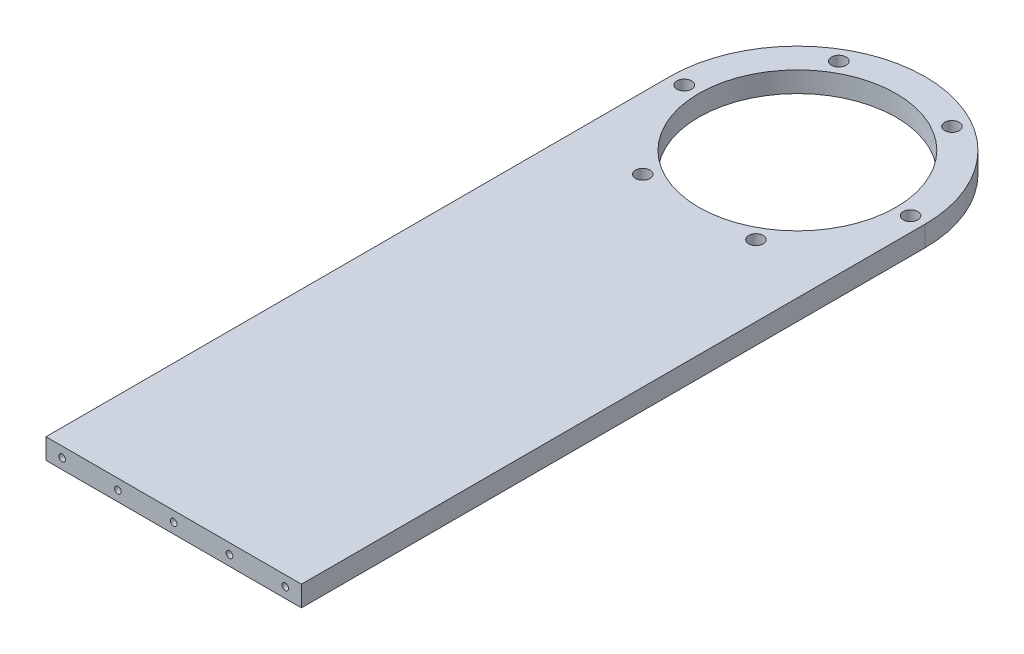
ISO-10303-21;
HEADER;
FILE_DESCRIPTION(('STEP AP214'),'2;1');
FILE_NAME('part.step','',(''),(''),'','','');
FILE_SCHEMA(('AUTOMOTIVE_DESIGN { 1 0 10303 214 1 1 1 1 }'));
ENDSEC;
DATA;
#1=APPLICATION_CONTEXT('core data for automotive mechanical design processes');
#2=APPLICATION_PROTOCOL_DEFINITION('international standard','automotive_design',2000,#1);
#3=PRODUCT_CONTEXT('',#1,'mechanical');
#4=PRODUCT('Part','Part','',(#3));
#5=PRODUCT_RELATED_PRODUCT_CATEGORY('part','',(#4));
#6=PRODUCT_DEFINITION_FORMATION('','',#4);
#7=PRODUCT_DEFINITION_CONTEXT('part definition',#1,'design');
#8=PRODUCT_DEFINITION('design','',#6,#7);
#9=PRODUCT_DEFINITION_SHAPE('','',#8);
#10=(LENGTH_UNIT() NAMED_UNIT(*) SI_UNIT(.MILLI.,.METRE.));
#11=(NAMED_UNIT(*) PLANE_ANGLE_UNIT() SI_UNIT($,.RADIAN.));
#12=(NAMED_UNIT(*) SI_UNIT($,.STERADIAN.) SOLID_ANGLE_UNIT());
#13=UNCERTAINTY_MEASURE_WITH_UNIT(LENGTH_MEASURE(1.E-05),#10,'distance_accuracy_value','');
#14=(GEOMETRIC_REPRESENTATION_CONTEXT(3) GLOBAL_UNCERTAINTY_ASSIGNED_CONTEXT((#13)) GLOBAL_UNIT_ASSIGNED_CONTEXT((#10,
#11,#12)) REPRESENTATION_CONTEXT('',''));
#15=CARTESIAN_POINT('',(0.,0.,0.));
#16=DIRECTION('',(0.,0.,1.));
#17=DIRECTION('',(1.,0.,0.));
#18=AXIS2_PLACEMENT_3D('',#15,#16,#17);
#19=CARTESIAN_POINT('',(0.,6.35,-96.445));
#20=DIRECTION('',(0.,-1.,0.));
#21=DIRECTION('',(0.,0.,-1.));
#22=AXIS2_PLACEMENT_3D('',#19,#20,#21);
#23=CYLINDRICAL_SURFACE('',#22,39.5);
#24=CARTESIAN_POINT('',(0.,0.,-96.445));
#25=DIRECTION('',(0.,1.,0.));
#26=DIRECTION('',(0.,0.,1.));
#27=AXIS2_PLACEMENT_3D('',#24,#25,#26);
#28=CIRCLE('',#27,39.5);
#29=CARTESIAN_POINT('',(39.5,0.,-96.4449995220233));
#30=VERTEX_POINT('',#29);
#31=CARTESIAN_POINT('',(-39.5,0.,-96.445));
#32=VERTEX_POINT('',#31);
#33=EDGE_CURVE('E144',#30,#32,#28,.T.);
#34=ORIENTED_EDGE('',*,*,#33,.T.);
#35=DIRECTION('',(0.,-1.,0.));
#36=VECTOR('',#35,1.);
#37=CARTESIAN_POINT('',(-39.5,6.35,-96.445));
#38=LINE('',#37,#36);
#39=CARTESIAN_POINT('',(-39.5,6.35,-96.445));
#40=VERTEX_POINT('',#39);
#41=EDGE_CURVE('E11',#40,#32,#38,.T.);
#42=ORIENTED_EDGE('',*,*,#41,.F.);
#43=CARTESIAN_POINT('',(0.,6.35,-96.445));
#44=DIRECTION('',(0.,1.,0.));
#45=DIRECTION('',(0.,0.,1.));
#46=AXIS2_PLACEMENT_3D('',#43,#44,#45);
#47=CIRCLE('',#46,39.5);
#48=CARTESIAN_POINT('',(39.5,6.35,-96.4449995220233));
#49=VERTEX_POINT('',#48);
#50=EDGE_CURVE('E145',#49,#40,#47,.T.);
#51=ORIENTED_EDGE('',*,*,#50,.F.);
#52=DIRECTION('',(0.,-1.,0.));
#53=VECTOR('',#52,1.);
#54=CARTESIAN_POINT('',(39.5,6.35,-96.4449995220233));
#55=LINE('',#54,#53);
#56=EDGE_CURVE('E61',#49,#30,#55,.T.);
#57=ORIENTED_EDGE('',*,*,#56,.T.);
#58=EDGE_LOOP('',(#34,#42,#51,#57));
#59=FACE_BOUND('',#58,.T.);
#60=ADVANCED_FACE('F45',(#59),#23,.T.);
#61=CARTESIAN_POINT('',(-39.5000005835248,6.35,-2.38988350905568E-07));
#62=DIRECTION('',(1.,0.,6.05033790822901E-09));
#63=DIRECTION('',(6.05033790822901E-09,0.,-1.));
#64=AXIS2_PLACEMENT_3D('',#61,#62,#63);
#65=PLANE('',#64);
#66=DIRECTION('',(-6.05033790822901E-09,0.,1.));
#67=VECTOR('',#66,1.);
#68=CARTESIAN_POINT('',(-39.5000005835248,0.,-2.38988350905568E-07));
#69=LINE('',#68,#67);
#70=CARTESIAN_POINT('',(-39.5000011670497,0.,96.445));
#71=VERTEX_POINT('',#70);
#72=EDGE_CURVE('E176',#32,#71,#69,.T.);
#73=ORIENTED_EDGE('',*,*,#72,.T.);
#74=DIRECTION('',(0.,-1.,0.));
#75=VECTOR('',#74,1.);
#76=CARTESIAN_POINT('',(-39.5000011670497,6.35,96.445));
#77=LINE('',#76,#75);
#78=CARTESIAN_POINT('',(-39.5000011670497,6.35,96.445));
#79=VERTEX_POINT('',#78);
#80=EDGE_CURVE('E53',#79,#71,#77,.T.);
#81=ORIENTED_EDGE('',*,*,#80,.F.);
#82=DIRECTION('',(-6.05033790822901E-09,0.,1.));
#83=VECTOR('',#82,1.);
#84=CARTESIAN_POINT('',(-39.5000005835248,6.35,-2.38988350905568E-07));
#85=LINE('',#84,#83);
#86=EDGE_CURVE('E88',#40,#79,#85,.T.);
#87=ORIENTED_EDGE('',*,*,#86,.F.);
#88=ORIENTED_EDGE('',*,*,#41,.T.);
#89=EDGE_LOOP('',(#73,#81,#87,#88));
#90=FACE_BOUND('',#89,.T.);
#91=ADVANCED_FACE('F231',(#90),#65,.F.);
#92=CARTESIAN_POINT('',(-5.83524864217903E-07,6.35,96.4450002389883));
#93=DIRECTION('',(6.05033814891329E-09,0.,-1.));
#94=DIRECTION('',(-1.,0.,-6.05033814891329E-09));
#95=AXIS2_PLACEMENT_3D('',#92,#93,#94);
#96=PLANE('',#95);
#97=CARTESIAN_POINT('',(-5.83524864217903E-07,3.175,96.4450002389883));
#98=DIRECTION('',(-6.05033814891329E-09,0.,1.));
#99=DIRECTION('',(1.,0.,6.05033814891329E-09));
#100=AXIS2_PLACEMENT_3D('',#97,#98,#99);
#101=CIRCLE('',#100,1.02499999999999);
#102=CARTESIAN_POINT('',(1.02499941647513,3.175,96.4450002451899));
#103=VERTEX_POINT('',#102);
#104=EDGE_CURVE('E116',#103,#103,#101,.T.);
#105=ORIENTED_EDGE('',*,*,#104,.F.);
#106=EDGE_LOOP('',(#105));
#107=FACE_BOUND('',#106,.T.);
#108=CARTESIAN_POINT('',(17.2499991247127,3.175,96.4450003433567));
#109=DIRECTION('',(-6.05033814891329E-09,0.,1.));
#110=DIRECTION('',(1.,0.,6.05033814891329E-09));
#111=AXIS2_PLACEMENT_3D('',#108,#109,#110);
#112=CIRCLE('',#111,1.02499999999999);
#113=CARTESIAN_POINT('',(18.2749991247127,3.175,96.4450003495583));
#114=VERTEX_POINT('',#113);
#115=EDGE_CURVE('E115',#114,#114,#112,.T.);
#116=ORIENTED_EDGE('',*,*,#115,.F.);
#117=EDGE_LOOP('',(#116));
#118=FACE_BOUND('',#117,.T.);
#119=CARTESIAN_POINT('',(34.4999988329503,3.175,96.445000447725));
#120=DIRECTION('',(-6.05033814891329E-09,0.,1.));
#121=DIRECTION('',(1.,0.,6.05033814891329E-09));
#122=AXIS2_PLACEMENT_3D('',#119,#120,#121);
#123=CIRCLE('',#122,1.02499999999999);
#124=CARTESIAN_POINT('',(35.5249988329503,3.175,96.4450004539266));
#125=VERTEX_POINT('',#124);
#126=EDGE_CURVE('E126',#125,#125,#123,.T.);
#127=ORIENTED_EDGE('',*,*,#126,.F.);
#128=EDGE_LOOP('',(#127));
#129=FACE_BOUND('',#128,.T.);
#130=CARTESIAN_POINT('',(-17.2500002917625,3.175,96.44500013462));
#131=DIRECTION('',(-6.05033814891329E-09,0.,1.));
#132=DIRECTION('',(1.,0.,6.05033814891329E-09));
#133=AXIS2_PLACEMENT_3D('',#130,#131,#132);
#134=CIRCLE('',#133,1.02499999999999);
#135=CARTESIAN_POINT('',(-16.2250002917625,3.175,96.4450001408216));
#136=VERTEX_POINT('',#135);
#137=EDGE_CURVE('E132',#136,#136,#134,.T.);
#138=ORIENTED_EDGE('',*,*,#137,.F.);
#139=EDGE_LOOP('',(#138));
#140=FACE_BOUND('',#139,.T.);
#141=CARTESIAN_POINT('',(-34.5,3.175,96.4450000302517));
#142=DIRECTION('',(-6.05033814891329E-09,0.,1.));
#143=DIRECTION('',(1.,0.,6.05033814891329E-09));
#144=AXIS2_PLACEMENT_3D('',#141,#142,#143);
#145=CIRCLE('',#144,1.02499999999999);
#146=CARTESIAN_POINT('',(-33.4750000000001,3.175,96.4450000364533));
#147=VERTEX_POINT('',#146);
#148=EDGE_CURVE('E138',#147,#147,#145,.T.);
#149=ORIENTED_EDGE('',*,*,#148,.F.);
#150=EDGE_LOOP('',(#149));
#151=FACE_BOUND('',#150,.T.);
#152=DIRECTION('',(1.,0.,6.05033814891329E-09));
#153=VECTOR('',#152,1.);
#154=CARTESIAN_POINT('',(-5.83524864217903E-07,0.,96.4450002389883));
#155=LINE('',#154,#153);
#156=CARTESIAN_POINT('',(39.4999988329503,0.,96.4450004779767));
#157=VERTEX_POINT('',#156);
#158=EDGE_CURVE('E178',#71,#157,#155,.T.);
#159=ORIENTED_EDGE('',*,*,#158,.T.);
#160=DIRECTION('',(0.,-1.,0.));
#161=VECTOR('',#160,1.);
#162=CARTESIAN_POINT('',(39.4999988329503,6.35,96.4450004779767));
#163=LINE('',#162,#161);
#164=CARTESIAN_POINT('',(39.4999988329503,6.35,96.4450004779767));
#165=VERTEX_POINT('',#164);
#166=EDGE_CURVE('E77',#165,#157,#163,.T.);
#167=ORIENTED_EDGE('',*,*,#166,.F.);
#168=DIRECTION('',(1.,0.,6.05033814891329E-09));
#169=VECTOR('',#168,1.);
#170=CARTESIAN_POINT('',(-5.83524864217903E-07,6.35,96.4450002389883));
#171=LINE('',#170,#169);
#172=EDGE_CURVE('E149',#79,#165,#171,.T.);
#173=ORIENTED_EDGE('',*,*,#172,.F.);
#174=ORIENTED_EDGE('',*,*,#80,.T.);
#175=EDGE_LOOP('',(#159,#167,#173,#174));
#176=FACE_BOUND('',#175,.T.);
#177=ADVANCED_FACE('F210',(#107,#118,#129,#140,#151,#176),#96,.F.);
#178=CARTESIAN_POINT('',(17.4999999999998,6.35,-126.755889132456));
#179=DIRECTION('',(0.,-1.,0.));
#180=DIRECTION('',(0.,0.,-1.));
#181=AXIS2_PLACEMENT_3D('',#178,#179,#180);
#182=CYLINDRICAL_SURFACE('',#181,2.25);
#183=CARTESIAN_POINT('',(17.4999999999998,6.35,-126.755889132456));
#184=DIRECTION('',(0.,1.,0.));
#185=DIRECTION('',(0.,0.,1.));
#186=AXIS2_PLACEMENT_3D('',#183,#184,#185);
#187=CIRCLE('',#186,2.25);
#188=CARTESIAN_POINT('',(17.4999999999998,6.35,-124.505889132456));
#189=VERTEX_POINT('',#188);
#190=EDGE_CURVE('E169',#189,#189,#187,.T.);
#191=ORIENTED_EDGE('',*,*,#190,.T.);
#192=EDGE_LOOP('',(#191));
#193=FACE_BOUND('',#192,.T.);
#194=CARTESIAN_POINT('',(17.4999999999998,0.,-126.755889132456));
#195=DIRECTION('',(0.,1.,0.));
#196=DIRECTION('',(0.,0.,1.));
#197=AXIS2_PLACEMENT_3D('',#194,#195,#196);
#198=CIRCLE('',#197,2.25);
#199=CARTESIAN_POINT('',(17.4999999999998,0.,-124.505889132456));
#200=VERTEX_POINT('',#199);
#201=EDGE_CURVE('E199',#200,#200,#198,.T.);
#202=ORIENTED_EDGE('',*,*,#201,.F.);
#203=EDGE_LOOP('',(#202));
#204=FACE_BOUND('',#203,.T.);
#205=ADVANCED_FACE('F267',(#193,#204),#182,.F.);
#206=CARTESIAN_POINT('',(-17.5,6.35,-66.1341108675446));
#207=DIRECTION('',(0.,-1.,0.));
#208=DIRECTION('',(0.,0.,-1.));
#209=AXIS2_PLACEMENT_3D('',#206,#207,#208);
#210=CYLINDRICAL_SURFACE('',#209,2.25);
#211=CARTESIAN_POINT('',(-17.5,6.35,-66.1341108675446));
#212=DIRECTION('',(0.,1.,0.));
#213=DIRECTION('',(0.,0.,1.));
#214=AXIS2_PLACEMENT_3D('',#211,#212,#213);
#215=CIRCLE('',#214,2.25);
#216=CARTESIAN_POINT('',(-17.5,6.35,-63.8841108675446));
#217=VERTEX_POINT('',#216);
#218=EDGE_CURVE('E166',#217,#217,#215,.T.);
#219=ORIENTED_EDGE('',*,*,#218,.T.);
#220=EDGE_LOOP('',(#219));
#221=FACE_BOUND('',#220,.T.);
#222=CARTESIAN_POINT('',(-17.5,0.,-66.1341108675446));
#223=DIRECTION('',(0.,1.,0.));
#224=DIRECTION('',(0.,0.,1.));
#225=AXIS2_PLACEMENT_3D('',#222,#223,#224);
#226=CIRCLE('',#225,2.25);
#227=CARTESIAN_POINT('',(-17.5,0.,-63.8841108675446));
#228=VERTEX_POINT('',#227);
#229=EDGE_CURVE('E196',#228,#228,#226,.T.);
#230=ORIENTED_EDGE('',*,*,#229,.F.);
#231=EDGE_LOOP('',(#230));
#232=FACE_BOUND('',#231,.T.);
#233=ADVANCED_FACE('F270',(#221,#232),#210,.F.);
#234=CARTESIAN_POINT('',(17.5,6.35,-66.1341108675446));
#235=DIRECTION('',(0.,-1.,0.));
#236=DIRECTION('',(0.,0.,-1.));
#237=AXIS2_PLACEMENT_3D('',#234,#235,#236);
#238=CYLINDRICAL_SURFACE('',#237,2.25000000000001);
#239=CARTESIAN_POINT('',(17.5,6.35,-66.1341108675446));
#240=DIRECTION('',(0.,1.,0.));
#241=DIRECTION('',(0.,0.,1.));
#242=AXIS2_PLACEMENT_3D('',#239,#240,#241);
#243=CIRCLE('',#242,2.25000000000001);
#244=CARTESIAN_POINT('',(17.5,6.35,-63.8841108675446));
#245=VERTEX_POINT('',#244);
#246=EDGE_CURVE('E163',#245,#245,#243,.T.);
#247=ORIENTED_EDGE('',*,*,#246,.T.);
#248=EDGE_LOOP('',(#247));
#249=FACE_BOUND('',#248,.T.);
#250=CARTESIAN_POINT('',(17.5,0.,-66.1341108675446));
#251=DIRECTION('',(0.,1.,0.));
#252=DIRECTION('',(0.,0.,1.));
#253=AXIS2_PLACEMENT_3D('',#250,#251,#252);
#254=CIRCLE('',#253,2.25000000000001);
#255=CARTESIAN_POINT('',(17.5,0.,-63.8841108675446));
#256=VERTEX_POINT('',#255);
#257=EDGE_CURVE('E193',#256,#256,#254,.T.);
#258=ORIENTED_EDGE('',*,*,#257,.F.);
#259=EDGE_LOOP('',(#258));
#260=FACE_BOUND('',#259,.T.);
#261=ADVANCED_FACE('F274',(#249,#260),#238,.F.);
#262=CARTESIAN_POINT('',(35.,6.35,-96.445));
#263=DIRECTION('',(0.,-1.,0.));
#264=DIRECTION('',(0.,0.,-1.));
#265=AXIS2_PLACEMENT_3D('',#262,#263,#264);
#266=CYLINDRICAL_SURFACE('',#265,2.25);
#267=CARTESIAN_POINT('',(35.,6.35,-96.445));
#268=DIRECTION('',(0.,1.,0.));
#269=DIRECTION('',(0.,0.,1.));
#270=AXIS2_PLACEMENT_3D('',#267,#268,#269);
#271=CIRCLE('',#270,2.25);
#272=CARTESIAN_POINT('',(35.,6.35,-94.195));
#273=VERTEX_POINT('',#272);
#274=EDGE_CURVE('E160',#273,#273,#271,.T.);
#275=ORIENTED_EDGE('',*,*,#274,.T.);
#276=EDGE_LOOP('',(#275));
#277=FACE_BOUND('',#276,.T.);
#278=CARTESIAN_POINT('',(35.,0.,-96.445));
#279=DIRECTION('',(0.,1.,0.));
#280=DIRECTION('',(0.,0.,1.));
#281=AXIS2_PLACEMENT_3D('',#278,#279,#280);
#282=CIRCLE('',#281,2.25);
#283=CARTESIAN_POINT('',(35.,0.,-94.195));
#284=VERTEX_POINT('',#283);
#285=EDGE_CURVE('E190',#284,#284,#282,.T.);
#286=ORIENTED_EDGE('',*,*,#285,.F.);
#287=EDGE_LOOP('',(#286));
#288=FACE_BOUND('',#287,.T.);
#289=ADVANCED_FACE('F278',(#277,#288),#266,.F.);
#290=CARTESIAN_POINT('',(-35.,6.35,-96.4450000000001));
#291=DIRECTION('',(0.,-1.,0.));
#292=DIRECTION('',(0.,0.,-1.));
#293=AXIS2_PLACEMENT_3D('',#290,#291,#292);
#294=CYLINDRICAL_SURFACE('',#293,2.25000000000001);
#295=CARTESIAN_POINT('',(-35.,6.35,-96.4450000000001));
#296=DIRECTION('',(0.,1.,0.));
#297=DIRECTION('',(0.,0.,1.));
#298=AXIS2_PLACEMENT_3D('',#295,#296,#297);
#299=CIRCLE('',#298,2.25000000000001);
#300=CARTESIAN_POINT('',(-35.,6.35,-94.195));
#301=VERTEX_POINT('',#300);
#302=EDGE_CURVE('E157',#301,#301,#299,.T.);
#303=ORIENTED_EDGE('',*,*,#302,.T.);
#304=EDGE_LOOP('',(#303));
#305=FACE_BOUND('',#304,.T.);
#306=CARTESIAN_POINT('',(-35.,0.,-96.4450000000001));
#307=DIRECTION('',(0.,1.,0.));
#308=DIRECTION('',(0.,0.,1.));
#309=AXIS2_PLACEMENT_3D('',#306,#307,#308);
#310=CIRCLE('',#309,2.25000000000001);
#311=CARTESIAN_POINT('',(-35.,0.,-94.195));
#312=VERTEX_POINT('',#311);
#313=EDGE_CURVE('E187',#312,#312,#310,.T.);
#314=ORIENTED_EDGE('',*,*,#313,.F.);
#315=EDGE_LOOP('',(#314));
#316=FACE_BOUND('',#315,.T.);
#317=ADVANCED_FACE('F226',(#305,#316),#294,.F.);
#318=CARTESIAN_POINT('',(0.,6.35,-96.445));
#319=DIRECTION('',(0.,-1.,0.));
#320=DIRECTION('',(0.,0.,-1.));
#321=AXIS2_PLACEMENT_3D('',#318,#319,#320);
#322=CYLINDRICAL_SURFACE('',#321,30.5);
#323=CARTESIAN_POINT('',(0.,6.35,-96.445));
#324=DIRECTION('',(0.,1.,0.));
#325=DIRECTION('',(0.,0.,1.));
#326=AXIS2_PLACEMENT_3D('',#323,#324,#325);
#327=CIRCLE('',#326,30.5);
#328=CARTESIAN_POINT('',(0.,6.35,-65.945));
#329=VERTEX_POINT('',#328);
#330=EDGE_CURVE('E153',#329,#329,#327,.T.);
#331=ORIENTED_EDGE('',*,*,#330,.T.);
#332=EDGE_LOOP('',(#331));
#333=FACE_BOUND('',#332,.T.);
#334=CARTESIAN_POINT('',(0.,0.,-96.445));
#335=DIRECTION('',(0.,1.,0.));
#336=DIRECTION('',(0.,0.,1.));
#337=AXIS2_PLACEMENT_3D('',#334,#335,#336);
#338=CIRCLE('',#337,30.5);
#339=CARTESIAN_POINT('',(0.,0.,-65.945));
#340=VERTEX_POINT('',#339);
#341=EDGE_CURVE('E183',#340,#340,#338,.T.);
#342=ORIENTED_EDGE('',*,*,#341,.F.);
#343=EDGE_LOOP('',(#342));
#344=FACE_BOUND('',#343,.T.);
#345=ADVANCED_FACE('F217',(#333,#344),#322,.F.);
#346=CARTESIAN_POINT('',(39.4999994164752,6.35,2.38988345265469E-07));
#347=DIRECTION('',(1.,0.,6.05033794420233E-09));
#348=DIRECTION('',(6.05033794420233E-09,0.,-1.));
#349=AXIS2_PLACEMENT_3D('',#346,#347,#348);
#350=PLANE('',#349);
#351=DIRECTION('',(-6.05033794420233E-09,0.,1.));
#352=VECTOR('',#351,1.);
#353=CARTESIAN_POINT('',(39.4999994164752,0.,2.38988345265469E-07));
#354=LINE('',#353,#352);
#355=EDGE_CURVE('E180',#30,#157,#354,.T.);
#356=ORIENTED_EDGE('',*,*,#355,.F.);
#357=ORIENTED_EDGE('',*,*,#56,.F.);
#358=DIRECTION('',(-6.05033794420233E-09,0.,1.));
#359=VECTOR('',#358,1.);
#360=CARTESIAN_POINT('',(39.4999994164752,6.35,2.38988345265469E-07));
#361=LINE('',#360,#359);
#362=EDGE_CURVE('E151',#49,#165,#361,.T.);
#363=ORIENTED_EDGE('',*,*,#362,.T.);
#364=ORIENTED_EDGE('',*,*,#166,.T.);
#365=EDGE_LOOP('',(#356,#357,#363,#364));
#366=FACE_BOUND('',#365,.T.);
#367=ADVANCED_FACE('F214',(#366),#350,.T.);
#368=CARTESIAN_POINT('',(-17.5000000000003,6.35,-126.755889132456));
#369=DIRECTION('',(0.,-1.,0.));
#370=DIRECTION('',(0.,0.,-1.));
#371=AXIS2_PLACEMENT_3D('',#368,#369,#370);
#372=CYLINDRICAL_SURFACE('',#371,2.25000000000001);
#373=CARTESIAN_POINT('',(-17.5000000000003,6.35,-126.755889132456));
#374=DIRECTION('',(0.,1.,0.));
#375=DIRECTION('',(0.,0.,1.));
#376=AXIS2_PLACEMENT_3D('',#373,#374,#375);
#377=CIRCLE('',#376,2.25000000000001);
#378=CARTESIAN_POINT('',(-17.5000000000003,6.35,-124.505889132456));
#379=VERTEX_POINT('',#378);
#380=EDGE_CURVE('E172',#379,#379,#377,.T.);
#381=ORIENTED_EDGE('',*,*,#380,.T.);
#382=EDGE_LOOP('',(#381));
#383=FACE_BOUND('',#382,.T.);
#384=CARTESIAN_POINT('',(-17.5000000000003,0.,-126.755889132456));
#385=DIRECTION('',(0.,1.,0.));
#386=DIRECTION('',(0.,0.,1.));
#387=AXIS2_PLACEMENT_3D('',#384,#385,#386);
#388=CIRCLE('',#387,2.25000000000001);
#389=CARTESIAN_POINT('',(-17.5000000000003,0.,-124.505889132456));
#390=VERTEX_POINT('',#389);
#391=EDGE_CURVE('E147',#390,#390,#388,.T.);
#392=ORIENTED_EDGE('',*,*,#391,.F.);
#393=EDGE_LOOP('',(#392));
#394=FACE_BOUND('',#393,.T.);
#395=ADVANCED_FACE('F216',(#383,#394),#372,.F.);
#396=CARTESIAN_POINT('',(0.,6.35,0.));
#397=DIRECTION('',(0.,1.,0.));
#398=DIRECTION('',(0.,0.,1.));
#399=AXIS2_PLACEMENT_3D('',#396,#397,#398);
#400=PLANE('',#399);
#401=ORIENTED_EDGE('',*,*,#50,.T.);
#402=ORIENTED_EDGE('',*,*,#86,.T.);
#403=ORIENTED_EDGE('',*,*,#172,.T.);
#404=ORIENTED_EDGE('',*,*,#362,.F.);
#405=EDGE_LOOP('',(#401,#402,#403,#404));
#406=FACE_BOUND('',#405,.T.);
#407=ORIENTED_EDGE('',*,*,#330,.F.);
#408=EDGE_LOOP('',(#407));
#409=FACE_BOUND('',#408,.T.);
#410=ORIENTED_EDGE('',*,*,#302,.F.);
#411=EDGE_LOOP('',(#410));
#412=FACE_BOUND('',#411,.T.);
#413=ORIENTED_EDGE('',*,*,#274,.F.);
#414=EDGE_LOOP('',(#413));
#415=FACE_BOUND('',#414,.T.);
#416=ORIENTED_EDGE('',*,*,#246,.F.);
#417=EDGE_LOOP('',(#416));
#418=FACE_BOUND('',#417,.T.);
#419=ORIENTED_EDGE('',*,*,#218,.F.);
#420=EDGE_LOOP('',(#419));
#421=FACE_BOUND('',#420,.T.);
#422=ORIENTED_EDGE('',*,*,#190,.F.);
#423=EDGE_LOOP('',(#422));
#424=FACE_BOUND('',#423,.T.);
#425=ORIENTED_EDGE('',*,*,#380,.F.);
#426=EDGE_LOOP('',(#425));
#427=FACE_BOUND('',#426,.T.);
#428=ADVANCED_FACE('F223',(#406,#409,#412,#415,#418,#421,#424,#427),#400,.T.);
#429=CARTESIAN_POINT('',(0.,0.,0.));
#430=DIRECTION('',(0.,1.,0.));
#431=DIRECTION('',(0.,0.,1.));
#432=AXIS2_PLACEMENT_3D('',#429,#430,#431);
#433=PLANE('',#432);
#434=ORIENTED_EDGE('',*,*,#33,.F.);
#435=ORIENTED_EDGE('',*,*,#355,.T.);
#436=ORIENTED_EDGE('',*,*,#158,.F.);
#437=ORIENTED_EDGE('',*,*,#72,.F.);
#438=EDGE_LOOP('',(#434,#435,#436,#437));
#439=FACE_BOUND('',#438,.T.);
#440=ORIENTED_EDGE('',*,*,#341,.T.);
#441=EDGE_LOOP('',(#440));
#442=FACE_BOUND('',#441,.T.);
#443=ORIENTED_EDGE('',*,*,#313,.T.);
#444=EDGE_LOOP('',(#443));
#445=FACE_BOUND('',#444,.T.);
#446=ORIENTED_EDGE('',*,*,#285,.T.);
#447=EDGE_LOOP('',(#446));
#448=FACE_BOUND('',#447,.T.);
#449=ORIENTED_EDGE('',*,*,#257,.T.);
#450=EDGE_LOOP('',(#449));
#451=FACE_BOUND('',#450,.T.);
#452=ORIENTED_EDGE('',*,*,#229,.T.);
#453=EDGE_LOOP('',(#452));
#454=FACE_BOUND('',#453,.T.);
#455=ORIENTED_EDGE('',*,*,#201,.T.);
#456=EDGE_LOOP('',(#455));
#457=FACE_BOUND('',#456,.T.);
#458=ORIENTED_EDGE('',*,*,#391,.T.);
#459=EDGE_LOOP('',(#458));
#460=FACE_BOUND('',#459,.T.);
#461=ADVANCED_FACE('F212',(#439,#442,#445,#448,#451,#454,#457,#460),#433,.F.);
#462=CARTESIAN_POINT('',(-34.4999999615804,3.175,90.0950000302517));
#463=DIRECTION('',(-6.05033814891329E-09,0.,1.));
#464=DIRECTION('',(1.,0.,6.05033814891329E-09));
#465=AXIS2_PLACEMENT_3D('',#462,#463,#464);
#466=CONICAL_SURFACE('',#465,1.02499999999999,1.02974425867665);
#467=CARTESIAN_POINT('',(-34.4999999578541,3.175,89.4791178957484));
#468=VERTEX_POINT('',#467);
#469=VERTEX_LOOP('',#468);
#470=FACE_BOUND('',#469,.T.);
#471=CARTESIAN_POINT('',(-34.4999999615804,3.175,90.0950000302517));
#472=DIRECTION('',(-6.05033814891329E-09,0.,1.));
#473=DIRECTION('',(1.,0.,6.05033814891329E-09));
#474=AXIS2_PLACEMENT_3D('',#471,#472,#473);
#475=CIRCLE('',#474,1.02499999999999);
#476=CARTESIAN_POINT('',(-33.4749999615804,3.175,90.0950000364533));
#477=VERTEX_POINT('',#476);
#478=EDGE_CURVE('E141',#477,#477,#475,.T.);
#479=ORIENTED_EDGE('',*,*,#478,.T.);
#480=EDGE_LOOP('',(#479));
#481=FACE_BOUND('',#480,.T.);
#482=ADVANCED_FACE('F258',(#470,#481),#466,.F.);
#483=CARTESIAN_POINT('',(-34.5,3.175,96.4450000302517));
#484=DIRECTION('',(-6.05033814891329E-09,0.,1.));
#485=DIRECTION('',(1.,0.,6.05033814891329E-09));
#486=AXIS2_PLACEMENT_3D('',#483,#484,#485);
#487=CYLINDRICAL_SURFACE('',#486,1.02499999999999);
#488=ORIENTED_EDGE('',*,*,#478,.F.);
#489=EDGE_LOOP('',(#488));
#490=FACE_BOUND('',#489,.T.);
#491=ORIENTED_EDGE('',*,*,#148,.T.);
#492=EDGE_LOOP('',(#491));
#493=FACE_BOUND('',#492,.T.);
#494=ADVANCED_FACE('F263',(#490,#493),#487,.F.);
#495=CARTESIAN_POINT('',(-17.2500002533428,3.175,90.09500013462));
#496=DIRECTION('',(-6.05033814891329E-09,0.,1.));
#497=DIRECTION('',(1.,0.,6.05033814891329E-09));
#498=AXIS2_PLACEMENT_3D('',#495,#496,#497);
#499=CONICAL_SURFACE('',#498,1.02499999999999,1.02974425867665);
#500=CARTESIAN_POINT('',(-17.2500002496165,3.175,89.4791180001168));
#501=VERTEX_POINT('',#500);
#502=VERTEX_LOOP('',#501);
#503=FACE_BOUND('',#502,.T.);
#504=CARTESIAN_POINT('',(-17.2500002533428,3.175,90.09500013462));
#505=DIRECTION('',(-6.05033814891329E-09,0.,1.));
#506=DIRECTION('',(1.,0.,6.05033814891329E-09));
#507=AXIS2_PLACEMENT_3D('',#504,#505,#506);
#508=CIRCLE('',#507,1.02499999999999);
#509=CARTESIAN_POINT('',(-16.2250002533428,3.175,90.0950001408216));
#510=VERTEX_POINT('',#509);
#511=EDGE_CURVE('E135',#510,#510,#508,.T.);
#512=ORIENTED_EDGE('',*,*,#511,.T.);
#513=EDGE_LOOP('',(#512));
#514=FACE_BOUND('',#513,.T.);
#515=ADVANCED_FACE('F361',(#503,#514),#499,.F.);
#516=CARTESIAN_POINT('',(-17.2500002917625,3.175,96.44500013462));
#517=DIRECTION('',(-6.05033814891329E-09,0.,1.));
#518=DIRECTION('',(1.,0.,6.05033814891329E-09));
#519=AXIS2_PLACEMENT_3D('',#516,#517,#518);
#520=CYLINDRICAL_SURFACE('',#519,1.02499999999999);
#521=ORIENTED_EDGE('',*,*,#511,.F.);
#522=EDGE_LOOP('',(#521));
#523=FACE_BOUND('',#522,.T.);
#524=ORIENTED_EDGE('',*,*,#137,.T.);
#525=EDGE_LOOP('',(#524));
#526=FACE_BOUND('',#525,.T.);
#527=ADVANCED_FACE('F373',(#523,#526),#520,.F.);
#528=CARTESIAN_POINT('',(34.49999887137,3.175,90.095000447725));
#529=DIRECTION('',(-6.05033814891329E-09,0.,1.));
#530=DIRECTION('',(1.,0.,6.05033814891329E-09));
#531=AXIS2_PLACEMENT_3D('',#528,#529,#530);
#532=CONICAL_SURFACE('',#531,1.02499999999999,1.02974425867665);
#533=CARTESIAN_POINT('',(34.4999988750963,3.175,89.4791183132218));
#534=VERTEX_POINT('',#533);
#535=VERTEX_LOOP('',#534);
#536=FACE_BOUND('',#535,.T.);
#537=CARTESIAN_POINT('',(34.49999887137,3.175,90.095000447725));
#538=DIRECTION('',(-6.05033814891329E-09,0.,1.));
#539=DIRECTION('',(1.,0.,6.05033814891329E-09));
#540=AXIS2_PLACEMENT_3D('',#537,#538,#539);
#541=CIRCLE('',#540,1.02499999999999);
#542=CARTESIAN_POINT('',(35.52499887137,3.175,90.0950004539266));
#543=VERTEX_POINT('',#542);
#544=EDGE_CURVE('E129',#543,#543,#541,.T.);
#545=ORIENTED_EDGE('',*,*,#544,.T.);
#546=EDGE_LOOP('',(#545));
#547=FACE_BOUND('',#546,.T.);
#548=ADVANCED_FACE('F383',(#536,#547),#532,.F.);
#549=CARTESIAN_POINT('',(34.4999988329503,3.175,96.445000447725));
#550=DIRECTION('',(-6.05033814891329E-09,0.,1.));
#551=DIRECTION('',(1.,0.,6.05033814891329E-09));
#552=AXIS2_PLACEMENT_3D('',#549,#550,#551);
#553=CYLINDRICAL_SURFACE('',#552,1.02499999999999);
#554=ORIENTED_EDGE('',*,*,#544,.F.);
#555=EDGE_LOOP('',(#554));
#556=FACE_BOUND('',#555,.T.);
#557=ORIENTED_EDGE('',*,*,#126,.T.);
#558=EDGE_LOOP('',(#557));
#559=FACE_BOUND('',#558,.T.);
#560=ADVANCED_FACE('F395',(#556,#559),#553,.F.);
#561=CARTESIAN_POINT('',(17.2499991631324,3.175,90.0950003433567));
#562=DIRECTION('',(-6.05033814891329E-09,0.,1.));
#563=DIRECTION('',(1.,0.,6.05033814891329E-09));
#564=AXIS2_PLACEMENT_3D('',#561,#562,#563);
#565=CONICAL_SURFACE('',#564,1.02499999999999,1.02974425867665);
#566=CARTESIAN_POINT('',(17.2499991668587,3.175,89.4791182088534));
#567=VERTEX_POINT('',#566);
#568=VERTEX_LOOP('',#567);
#569=FACE_BOUND('',#568,.T.);
#570=CARTESIAN_POINT('',(17.2499991631324,3.175,90.0950003433567));
#571=DIRECTION('',(-6.05033814891329E-09,0.,1.));
#572=DIRECTION('',(1.,0.,6.05033814891329E-09));
#573=AXIS2_PLACEMENT_3D('',#570,#571,#572);
#574=CIRCLE('',#573,1.02499999999999);
#575=CARTESIAN_POINT('',(18.2749991631324,3.175,90.0950003495583));
#576=VERTEX_POINT('',#575);
#577=EDGE_CURVE('E119',#576,#576,#574,.T.);
#578=ORIENTED_EDGE('',*,*,#577,.T.);
#579=EDGE_LOOP('',(#578));
#580=FACE_BOUND('',#579,.T.);
#581=ADVANCED_FACE('F405',(#569,#580),#565,.F.);
#582=CARTESIAN_POINT('',(17.2499991247127,3.175,96.4450003433567));
#583=DIRECTION('',(-6.05033814891329E-09,0.,1.));
#584=DIRECTION('',(1.,0.,6.05033814891329E-09));
#585=AXIS2_PLACEMENT_3D('',#582,#583,#584);
#586=CYLINDRICAL_SURFACE('',#585,1.02499999999999);
#587=ORIENTED_EDGE('',*,*,#577,.F.);
#588=EDGE_LOOP('',(#587));
#589=FACE_BOUND('',#588,.T.);
#590=ORIENTED_EDGE('',*,*,#115,.T.);
#591=EDGE_LOOP('',(#590));
#592=FACE_BOUND('',#591,.T.);
#593=ADVANCED_FACE('F109',(#589,#592),#586,.F.);
#594=CARTESIAN_POINT('',(-5.45105216972303E-07,3.175,90.0950002389883));
#595=DIRECTION('',(-6.05033814891329E-09,0.,1.));
#596=DIRECTION('',(1.,0.,6.05033814891329E-09));
#597=AXIS2_PLACEMENT_3D('',#594,#595,#596);
#598=CONICAL_SURFACE('',#597,1.02499999999999,1.02974425867665);
#599=CARTESIAN_POINT('',(-5.41378921798684E-07,3.175,89.4791181044851));
#600=VERTEX_POINT('',#599);
#601=VERTEX_LOOP('',#600);
#602=FACE_BOUND('',#601,.T.);
#603=CARTESIAN_POINT('',(-5.45105216972303E-07,3.175,90.0950002389883));
#604=DIRECTION('',(-6.05033814891329E-09,0.,1.));
#605=DIRECTION('',(1.,0.,6.05033814891329E-09));
#606=AXIS2_PLACEMENT_3D('',#603,#604,#605);
#607=CIRCLE('',#606,1.02499999999999);
#608=CARTESIAN_POINT('',(1.02499945489477,3.175,90.09500024519));
#609=VERTEX_POINT('',#608);
#610=EDGE_CURVE('E113',#609,#609,#607,.T.);
#611=ORIENTED_EDGE('',*,*,#610,.T.);
#612=EDGE_LOOP('',(#611));
#613=FACE_BOUND('',#612,.T.);
#614=ADVANCED_FACE('F105',(#602,#613),#598,.F.);
#615=CARTESIAN_POINT('',(-5.83524864217903E-07,3.175,96.4450002389883));
#616=DIRECTION('',(-6.05033814891329E-09,0.,1.));
#617=DIRECTION('',(1.,0.,6.05033814891329E-09));
#618=AXIS2_PLACEMENT_3D('',#615,#616,#617);
#619=CYLINDRICAL_SURFACE('',#618,1.02499999999999);
#620=ORIENTED_EDGE('',*,*,#610,.F.);
#621=EDGE_LOOP('',(#620));
#622=FACE_BOUND('',#621,.T.);
#623=ORIENTED_EDGE('',*,*,#104,.T.);
#624=EDGE_LOOP('',(#623));
#625=FACE_BOUND('',#624,.T.);
#626=ADVANCED_FACE('F108',(#622,#625),#619,.F.);
#627=CLOSED_SHELL('',(#60,#91,#177,#205,#233,#261,#289,#317,#345,#367,#395,#428,#461,#482,#494,
#515,#527,#548,#560,#581,#593,#614,#626));
#628=MANIFOLD_SOLID_BREP('B2',#627);
#629=ADVANCED_BREP_SHAPE_REPRESENTATION('',(#18,#628),#14);
#630=SHAPE_DEFINITION_REPRESENTATION(#9,#629);
ENDSEC;
END-ISO-10303-21;
